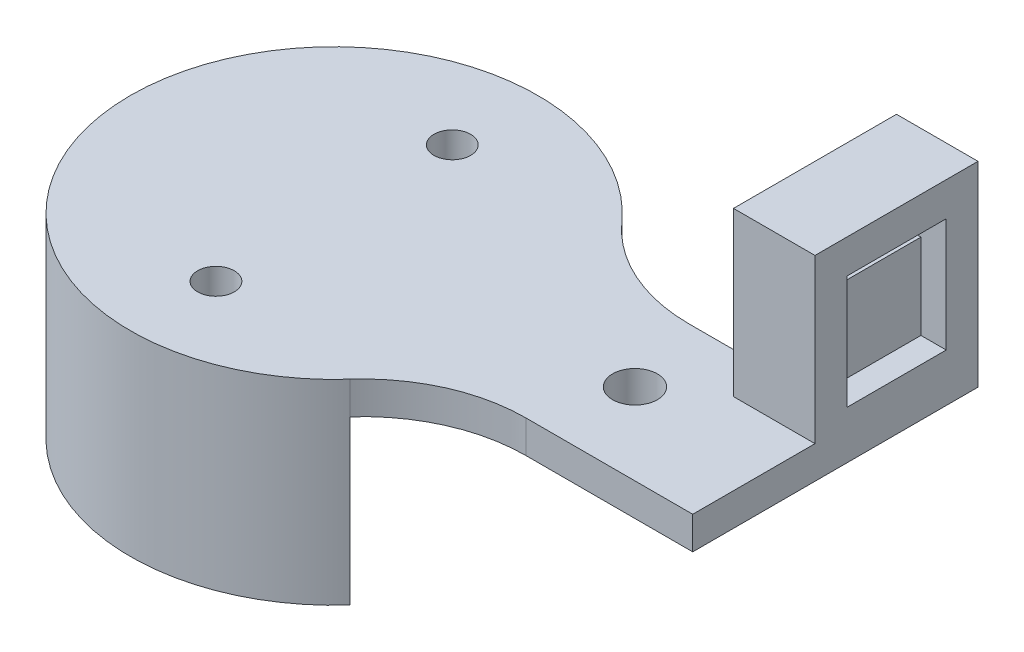
ISO-10303-21;
HEADER;
FILE_DESCRIPTION(('STEP AP214'),'2;1');
FILE_NAME('part.step','',(''),(''),'','','');
FILE_SCHEMA(('AUTOMOTIVE_DESIGN { 1 0 10303 214 1 1 1 1 }'));
ENDSEC;
DATA;
#1=APPLICATION_CONTEXT('core data for automotive mechanical design processes');
#2=APPLICATION_PROTOCOL_DEFINITION('international standard','automotive_design',2000,#1);
#3=PRODUCT_CONTEXT('',#1,'mechanical');
#4=PRODUCT('Part','Part','',(#3));
#5=PRODUCT_RELATED_PRODUCT_CATEGORY('part','',(#4));
#6=PRODUCT_DEFINITION_FORMATION('','',#4);
#7=PRODUCT_DEFINITION_CONTEXT('part definition',#1,'design');
#8=PRODUCT_DEFINITION('design','',#6,#7);
#9=PRODUCT_DEFINITION_SHAPE('','',#8);
#10=(LENGTH_UNIT() NAMED_UNIT(*) SI_UNIT(.MILLI.,.METRE.));
#11=(NAMED_UNIT(*) PLANE_ANGLE_UNIT() SI_UNIT($,.RADIAN.));
#12=(NAMED_UNIT(*) SI_UNIT($,.STERADIAN.) SOLID_ANGLE_UNIT());
#13=UNCERTAINTY_MEASURE_WITH_UNIT(LENGTH_MEASURE(1.E-05),#10,'distance_accuracy_value','');
#14=(GEOMETRIC_REPRESENTATION_CONTEXT(3) GLOBAL_UNCERTAINTY_ASSIGNED_CONTEXT((#13)) GLOBAL_UNIT_ASSIGNED_CONTEXT((#10,
#11,#12)) REPRESENTATION_CONTEXT('',''));
#15=CARTESIAN_POINT('',(0.,0.,0.));
#16=DIRECTION('',(0.,0.,1.));
#17=DIRECTION('',(1.,0.,0.));
#18=AXIS2_PLACEMENT_3D('',#15,#16,#17);
#19=CARTESIAN_POINT('',(54.,4.,-25.0000000000001));
#20=DIRECTION('',(-1.,0.,0.));
#21=DIRECTION('',(0.,0.,1.));
#22=AXIS2_PLACEMENT_3D('',#19,#20,#21);
#23=PLANE('',#22);
#24=DIRECTION('',(0.,0.,-1.));
#25=VECTOR('',#24,1.);
#26=CARTESIAN_POINT('',(54.,0.,-25.0000000000001));
#27=LINE('',#26,#25);
#28=CARTESIAN_POINT('',(54.,0.,9.99999999999999));
#29=VERTEX_POINT('',#28);
#30=CARTESIAN_POINT('',(54.,0.,-25.0000000000001));
#31=VERTEX_POINT('',#30);
#32=EDGE_CURVE('E348',#29,#31,#27,.T.);
#33=ORIENTED_EDGE('',*,*,#32,.T.);
#34=DIRECTION('',(0.,-1.,0.));
#35=VECTOR('',#34,1.);
#36=CARTESIAN_POINT('',(54.,4.,-25.0000000000001));
#37=LINE('',#36,#35);
#38=CARTESIAN_POINT('',(54.,24.,-25.0000000000001));
#39=VERTEX_POINT('',#38);
#40=EDGE_CURVE('E358',#39,#31,#37,.T.);
#41=ORIENTED_EDGE('',*,*,#40,.F.);
#42=DIRECTION('',(0.,0.,1.));
#43=VECTOR('',#42,1.);
#44=CARTESIAN_POINT('',(54.,24.,-25.0000000000001));
#45=LINE('',#44,#43);
#46=CARTESIAN_POINT('',(54.,24.,-5.00000000000011));
#47=VERTEX_POINT('',#46);
#48=EDGE_CURVE('E237',#39,#47,#45,.T.);
#49=ORIENTED_EDGE('',*,*,#48,.T.);
#50=DIRECTION('',(0.,-1.,0.));
#51=VECTOR('',#50,1.);
#52=CARTESIAN_POINT('',(54.,24.,-5.00000000000011));
#53=LINE('',#52,#51);
#54=CARTESIAN_POINT('',(54.,4.,-5.00000000000012));
#55=VERTEX_POINT('',#54);
#56=EDGE_CURVE('E247',#47,#55,#53,.T.);
#57=ORIENTED_EDGE('',*,*,#56,.T.);
#58=DIRECTION('',(0.,0.,-1.));
#59=VECTOR('',#58,1.);
#60=CARTESIAN_POINT('',(54.,4.,-25.0000000000001));
#61=LINE('',#60,#59);
#62=CARTESIAN_POINT('',(54.,4.,9.99999999999999));
#63=VERTEX_POINT('',#62);
#64=EDGE_CURVE('E355',#63,#55,#61,.T.);
#65=ORIENTED_EDGE('',*,*,#64,.F.);
#66=DIRECTION('',(0.,-1.,0.));
#67=VECTOR('',#66,1.);
#68=CARTESIAN_POINT('',(54.,4.,9.99999999999999));
#69=LINE('',#68,#67);
#70=EDGE_CURVE('E377',#63,#29,#69,.T.);
#71=ORIENTED_EDGE('',*,*,#70,.T.);
#72=EDGE_LOOP('',(#33,#41,#49,#57,#65,#71));
#73=FACE_BOUND('',#72,.T.);
#74=DIRECTION('',(0.,-1.,0.));
#75=VECTOR('',#74,1.);
#76=CARTESIAN_POINT('',(54.,18.1,-8.90000000000011));
#77=LINE('',#76,#75);
#78=CARTESIAN_POINT('',(54.,19.85,-8.90000000000011));
#79=VERTEX_POINT('',#78);
#80=CARTESIAN_POINT('',(54.,5.9,-8.90000000000011));
#81=VERTEX_POINT('',#80);
#82=EDGE_CURVE('E206',#79,#81,#77,.T.);
#83=ORIENTED_EDGE('',*,*,#82,.F.);
#84=DIRECTION('',(0.,0.,-1.));
#85=VECTOR('',#84,1.);
#86=CARTESIAN_POINT('',(54.,19.85,-8.90000000000011));
#87=LINE('',#86,#85);
#88=CARTESIAN_POINT('',(54.,19.85,-21.1000000000001));
#89=VERTEX_POINT('',#88);
#90=EDGE_CURVE('E500',#79,#89,#87,.T.);
#91=ORIENTED_EDGE('',*,*,#90,.T.);
#92=DIRECTION('',(0.,-1.,0.));
#93=VECTOR('',#92,1.);
#94=CARTESIAN_POINT('',(54.,18.1,-21.1000000000001));
#95=LINE('',#94,#93);
#96=CARTESIAN_POINT('',(54.,5.9,-21.1000000000001));
#97=VERTEX_POINT('',#96);
#98=EDGE_CURVE('E220',#89,#97,#95,.T.);
#99=ORIENTED_EDGE('',*,*,#98,.T.);
#100=DIRECTION('',(0.,0.,-1.));
#101=VECTOR('',#100,1.);
#102=CARTESIAN_POINT('',(54.,5.9,-8.90000000000011));
#103=LINE('',#102,#101);
#104=EDGE_CURVE('E213',#81,#97,#103,.T.);
#105=ORIENTED_EDGE('',*,*,#104,.F.);
#106=EDGE_LOOP('',(#83,#91,#99,#105));
#107=FACE_BOUND('',#106,.T.);
#108=ADVANCED_FACE('F41',(#73,#107),#23,.F.);
#109=CARTESIAN_POINT('',(44.,4.,-25.0000000000001));
#110=DIRECTION('',(0.,0.,1.));
#111=DIRECTION('',(1.,0.,0.));
#112=AXIS2_PLACEMENT_3D('',#109,#110,#111);
#113=PLANE('',#112);
#114=DIRECTION('',(-1.,0.,0.));
#115=VECTOR('',#114,1.);
#116=CARTESIAN_POINT('',(44.,0.,-25.0000000000001));
#117=LINE('',#116,#115);
#118=CARTESIAN_POINT('',(44.,0.,-25.0000000000001));
#119=VERTEX_POINT('',#118);
#120=EDGE_CURVE('E323',#31,#119,#117,.T.);
#121=ORIENTED_EDGE('',*,*,#120,.T.);
#122=DIRECTION('',(0.,-1.,0.));
#123=VECTOR('',#122,1.);
#124=CARTESIAN_POINT('',(44.,4.,-25.0000000000001));
#125=LINE('',#124,#123);
#126=CARTESIAN_POINT('',(44.,24.,-25.0000000000001));
#127=VERTEX_POINT('',#126);
#128=EDGE_CURVE('E385',#127,#119,#125,.T.);
#129=ORIENTED_EDGE('',*,*,#128,.F.);
#130=DIRECTION('',(1.,0.,0.));
#131=VECTOR('',#130,1.);
#132=CARTESIAN_POINT('',(44.,24.,-25.0000000000001));
#133=LINE('',#132,#131);
#134=EDGE_CURVE('E233',#127,#39,#133,.T.);
#135=ORIENTED_EDGE('',*,*,#134,.T.);
#136=ORIENTED_EDGE('',*,*,#40,.T.);
#137=EDGE_LOOP('',(#121,#129,#135,#136));
#138=FACE_BOUND('',#137,.T.);
#139=ADVANCED_FACE('F441',(#138),#113,.F.);
#140=CARTESIAN_POINT('',(44.,4.,-10.));
#141=DIRECTION('',(1.,0.,0.));
#142=DIRECTION('',(0.,0.,-1.));
#143=AXIS2_PLACEMENT_3D('',#140,#141,#142);
#144=PLANE('',#143);
#145=DIRECTION('',(0.,0.,1.));
#146=VECTOR('',#145,1.);
#147=CARTESIAN_POINT('',(44.,19.85,-8.90000000000027));
#148=LINE('',#147,#146);
#149=CARTESIAN_POINT('',(44.,19.85,-21.1000000000001));
#150=VERTEX_POINT('',#149);
#151=CARTESIAN_POINT('',(44.,19.85,-8.90000000000011));
#152=VERTEX_POINT('',#151);
#153=EDGE_CURVE('E491',#150,#152,#148,.T.);
#154=ORIENTED_EDGE('',*,*,#153,.T.);
#155=DIRECTION('',(0.,1.,0.));
#156=VECTOR('',#155,1.);
#157=CARTESIAN_POINT('',(44.,19.85,-8.90000000000011));
#158=LINE('',#157,#156);
#159=CARTESIAN_POINT('',(44.,16.35,-8.90000000000011));
#160=VERTEX_POINT('',#159);
#161=EDGE_CURVE('E493',#160,#152,#158,.T.);
#162=ORIENTED_EDGE('',*,*,#161,.F.);
#163=DIRECTION('',(0.,0.,1.));
#164=VECTOR('',#163,1.);
#165=CARTESIAN_POINT('',(44.,16.35,-8.90000000000027));
#166=LINE('',#165,#164);
#167=CARTESIAN_POINT('',(44.,16.35,-21.1000000000001));
#168=VERTEX_POINT('',#167);
#169=EDGE_CURVE('E192',#168,#160,#166,.T.);
#170=ORIENTED_EDGE('',*,*,#169,.F.);
#171=DIRECTION('',(0.,1.,0.));
#172=VECTOR('',#171,1.);
#173=CARTESIAN_POINT('',(44.,19.85,-21.1000000000001));
#174=LINE('',#173,#172);
#175=EDGE_CURVE('E58',#168,#150,#174,.T.);
#176=ORIENTED_EDGE('',*,*,#175,.T.);
#177=EDGE_LOOP('',(#154,#162,#170,#176));
#178=FACE_BOUND('',#177,.T.);
#179=DIRECTION('',(0.,0.,1.));
#180=VECTOR('',#179,1.);
#181=CARTESIAN_POINT('',(44.,0.,-10.));
#182=LINE('',#181,#180);
#183=CARTESIAN_POINT('',(44.,0.,-10.));
#184=VERTEX_POINT('',#183);
#185=EDGE_CURVE('E362',#119,#184,#182,.T.);
#186=ORIENTED_EDGE('',*,*,#185,.T.);
#187=DIRECTION('',(0.,-1.,0.));
#188=VECTOR('',#187,1.);
#189=CARTESIAN_POINT('',(44.,4.,-10.));
#190=LINE('',#189,#188);
#191=CARTESIAN_POINT('',(44.,4.,-10.));
#192=VERTEX_POINT('',#191);
#193=EDGE_CURVE('E381',#192,#184,#190,.T.);
#194=ORIENTED_EDGE('',*,*,#193,.F.);
#195=DIRECTION('',(0.,0.,1.));
#196=VECTOR('',#195,1.);
#197=CARTESIAN_POINT('',(44.,4.,-25.0000000000001));
#198=LINE('',#197,#196);
#199=CARTESIAN_POINT('',(44.,4.,-5.00000000000011));
#200=VERTEX_POINT('',#199);
#201=EDGE_CURVE('E11',#192,#200,#198,.T.);
#202=ORIENTED_EDGE('',*,*,#201,.T.);
#203=DIRECTION('',(0.,-1.,0.));
#204=VECTOR('',#203,1.);
#205=CARTESIAN_POINT('',(44.,24.,-5.00000000000011));
#206=LINE('',#205,#204);
#207=CARTESIAN_POINT('',(44.,24.,-5.00000000000011));
#208=VERTEX_POINT('',#207);
#209=EDGE_CURVE('E251',#208,#200,#206,.T.);
#210=ORIENTED_EDGE('',*,*,#209,.F.);
#211=DIRECTION('',(0.,0.,1.));
#212=VECTOR('',#211,1.);
#213=CARTESIAN_POINT('',(44.,24.,-25.0000000000001));
#214=LINE('',#213,#212);
#215=EDGE_CURVE('E244',#127,#208,#214,.T.);
#216=ORIENTED_EDGE('',*,*,#215,.F.);
#217=ORIENTED_EDGE('',*,*,#128,.T.);
#218=EDGE_LOOP('',(#186,#194,#202,#210,#216,#217));
#219=FACE_BOUND('',#218,.T.);
#220=ADVANCED_FACE('F437',(#178,#219),#144,.F.);
#221=CARTESIAN_POINT('',(22.9128784747792,4.,-10.0000000000001));
#222=DIRECTION('',(0.,0.,1.));
#223=DIRECTION('',(1.,0.,0.));
#224=AXIS2_PLACEMENT_3D('',#221,#222,#223);
#225=PLANE('',#224);
#226=DIRECTION('',(-1.,0.,0.));
#227=VECTOR('',#226,1.);
#228=CARTESIAN_POINT('',(22.9128784747792,0.,-10.0000000000001));
#229=LINE('',#228,#227);
#230=CARTESIAN_POINT('',(33.5410196624967,0.,-10.0000000000001));
#231=VERTEX_POINT('',#230);
#232=EDGE_CURVE('E365',#184,#231,#229,.T.);
#233=ORIENTED_EDGE('',*,*,#232,.T.);
#234=DIRECTION('',(0.,1.,0.));
#235=VECTOR('',#234,1.);
#236=CARTESIAN_POINT('',(33.5410196624967,4.,-10.0000000000001));
#237=LINE('',#236,#235);
#238=CARTESIAN_POINT('',(33.5410196624967,4.,-10.0000000000001));
#239=VERTEX_POINT('',#238);
#240=EDGE_CURVE('E400',#231,#239,#237,.T.);
#241=ORIENTED_EDGE('',*,*,#240,.T.);
#242=DIRECTION('',(-1.,0.,0.));
#243=VECTOR('',#242,1.);
#244=CARTESIAN_POINT('',(22.9128784747792,4.,-10.0000000000001));
#245=LINE('',#244,#243);
#246=EDGE_CURVE('E343',#192,#239,#245,.T.);
#247=ORIENTED_EDGE('',*,*,#246,.F.);
#248=ORIENTED_EDGE('',*,*,#193,.T.);
#249=EDGE_LOOP('',(#233,#241,#247,#248));
#250=FACE_BOUND('',#249,.T.);
#251=ADVANCED_FACE('F430',(#250),#225,.F.);
#252=CARTESIAN_POINT('',(0.,4.,0.));
#253=DIRECTION('',(0.,-1.,0.));
#254=DIRECTION('',(0.,0.,-1.));
#255=AXIS2_PLACEMENT_3D('',#252,#253,#254);
#256=CYLINDRICAL_SURFACE('',#255,25.);
#257=DIRECTION('',(0.,-1.,0.));
#258=VECTOR('',#257,1.);
#259=CARTESIAN_POINT('',(18.6338998124982,4.,-16.6666666666667));
#260=LINE('',#259,#258);
#261=CARTESIAN_POINT('',(18.6338998124982,4.,-16.6666666666667));
#262=VERTEX_POINT('',#261);
#263=CARTESIAN_POINT('',(18.6338998124982,0.,-16.6666666666667));
#264=VERTEX_POINT('',#263);
#265=EDGE_CURVE('E393',#262,#264,#260,.T.);
#266=ORIENTED_EDGE('',*,*,#265,.T.);
#267=DIRECTION('',(0.,1.,0.));
#268=VECTOR('',#267,1.);
#269=CARTESIAN_POINT('',(18.6338998124982,-20.,-16.6666666666667));
#270=LINE('',#269,#268);
#271=CARTESIAN_POINT('',(18.6338998124982,-20.,-16.6666666666667));
#272=VERTEX_POINT('',#271);
#273=EDGE_CURVE('E308',#272,#264,#270,.T.);
#274=ORIENTED_EDGE('',*,*,#273,.F.);
#275=CARTESIAN_POINT('',(0.,-20.,0.));
#276=DIRECTION('',(0.,-1.,0.));
#277=DIRECTION('',(0.,0.,-1.));
#278=AXIS2_PLACEMENT_3D('',#275,#276,#277);
#279=CIRCLE('',#278,25.);
#280=CARTESIAN_POINT('',(18.6338998124983,-20.,16.6666666666666));
#281=VERTEX_POINT('',#280);
#282=EDGE_CURVE('E267',#281,#272,#279,.T.);
#283=ORIENTED_EDGE('',*,*,#282,.F.);
#284=DIRECTION('',(0.,1.,0.));
#285=VECTOR('',#284,1.);
#286=CARTESIAN_POINT('',(18.6338998124983,-20.,16.6666666666666));
#287=LINE('',#286,#285);
#288=CARTESIAN_POINT('',(18.6338998124983,0.,16.6666666666666));
#289=VERTEX_POINT('',#288);
#290=EDGE_CURVE('E311',#281,#289,#287,.T.);
#291=ORIENTED_EDGE('',*,*,#290,.T.);
#292=DIRECTION('',(0.,-1.,0.));
#293=VECTOR('',#292,1.);
#294=CARTESIAN_POINT('',(18.6338998124983,4.,16.6666666666666));
#295=LINE('',#294,#293);
#296=CARTESIAN_POINT('',(18.6338998124983,4.,16.6666666666666));
#297=VERTEX_POINT('',#296);
#298=EDGE_CURVE('E397',#289,#297,#295,.F.);
#299=ORIENTED_EDGE('',*,*,#298,.T.);
#300=CARTESIAN_POINT('',(0.,4.,0.));
#301=DIRECTION('',(0.,1.,0.));
#302=DIRECTION('',(0.,0.,1.));
#303=AXIS2_PLACEMENT_3D('',#300,#301,#302);
#304=CIRCLE('',#303,25.);
#305=EDGE_CURVE('E347',#262,#297,#304,.T.);
#306=ORIENTED_EDGE('',*,*,#305,.F.);
#307=EDGE_LOOP('',(#266,#274,#283,#291,#299,#306));
#308=FACE_BOUND('',#307,.T.);
#309=ADVANCED_FACE('F426',(#308),#256,.T.);
#310=CARTESIAN_POINT('',(54.,4.,9.99999999999999));
#311=DIRECTION('',(0.,0.,-1.));
#312=DIRECTION('',(-1.,0.,0.));
#313=AXIS2_PLACEMENT_3D('',#310,#311,#312);
#314=PLANE('',#313);
#315=DIRECTION('',(1.,0.,0.));
#316=VECTOR('',#315,1.);
#317=CARTESIAN_POINT('',(54.,4.,9.99999999999999));
#318=LINE('',#317,#316);
#319=CARTESIAN_POINT('',(33.541019662497,4.,9.99999999999992));
#320=VERTEX_POINT('',#319);
#321=EDGE_CURVE('E352',#320,#63,#318,.T.);
#322=ORIENTED_EDGE('',*,*,#321,.F.);
#323=DIRECTION('',(0.,1.,0.));
#324=VECTOR('',#323,1.);
#325=CARTESIAN_POINT('',(33.541019662497,0.,9.99999999999993));
#326=LINE('',#325,#324);
#327=CARTESIAN_POINT('',(33.541019662497,0.,9.99999999999992));
#328=VERTEX_POINT('',#327);
#329=EDGE_CURVE('E389',#320,#328,#326,.F.);
#330=ORIENTED_EDGE('',*,*,#329,.T.);
#331=DIRECTION('',(1.,0.,0.));
#332=VECTOR('',#331,1.);
#333=CARTESIAN_POINT('',(54.,0.,9.99999999999999));
#334=LINE('',#333,#332);
#335=EDGE_CURVE('E369',#328,#29,#334,.T.);
#336=ORIENTED_EDGE('',*,*,#335,.T.);
#337=ORIENTED_EDGE('',*,*,#70,.F.);
#338=EDGE_LOOP('',(#322,#330,#336,#337));
#339=FACE_BOUND('',#338,.T.);
#340=ADVANCED_FACE('F456',(#339),#314,.F.);
#341=CARTESIAN_POINT('',(0.,4.,0.));
#342=DIRECTION('',(0.,1.,0.));
#343=DIRECTION('',(0.,0.,1.));
#344=AXIS2_PLACEMENT_3D('',#341,#342,#343);
#345=PLANE('',#344);
#346=DIRECTION('',(1.,0.,0.));
#347=VECTOR('',#346,1.);
#348=CARTESIAN_POINT('',(44.,4.,-5.00000000000011));
#349=LINE('',#348,#347);
#350=EDGE_CURVE('E232',#200,#55,#349,.T.);
#351=ORIENTED_EDGE('',*,*,#350,.F.);
#352=ORIENTED_EDGE('',*,*,#201,.F.);
#353=ORIENTED_EDGE('',*,*,#246,.T.);
#354=CARTESIAN_POINT('',(33.5410196624968,4.,-30.0000000000001));
#355=DIRECTION('',(0.,1.,0.));
#356=DIRECTION('',(0.,0.,1.));
#357=AXIS2_PLACEMENT_3D('',#354,#355,#356);
#358=CIRCLE('',#357,20.);
#359=EDGE_CURVE('E45',#239,#262,#358,.F.);
#360=ORIENTED_EDGE('',*,*,#359,.T.);
#361=ORIENTED_EDGE('',*,*,#305,.T.);
#362=CARTESIAN_POINT('',(33.5410196624969,4.,29.9999999999999));
#363=DIRECTION('',(0.,1.,0.));
#364=DIRECTION('',(0.,0.,1.));
#365=AXIS2_PLACEMENT_3D('',#362,#363,#364);
#366=CIRCLE('',#365,20.);
#367=EDGE_CURVE('E407',#297,#320,#366,.F.);
#368=ORIENTED_EDGE('',*,*,#367,.T.);
#369=ORIENTED_EDGE('',*,*,#321,.T.);
#370=ORIENTED_EDGE('',*,*,#64,.T.);
#371=EDGE_LOOP('',(#351,#352,#353,#360,#361,#368,#369,#370));
#372=FACE_BOUND('',#371,.T.);
#373=CARTESIAN_POINT('',(0.,4.,-14.5));
#374=DIRECTION('',(0.,1.,0.));
#375=DIRECTION('',(0.,0.,1.));
#376=AXIS2_PLACEMENT_3D('',#373,#374,#375);
#377=CIRCLE('',#376,2.25);
#378=CARTESIAN_POINT('',(0.,4.,-12.25));
#379=VERTEX_POINT('',#378);
#380=EDGE_CURVE('E319',#379,#379,#377,.T.);
#381=ORIENTED_EDGE('',*,*,#380,.F.);
#382=EDGE_LOOP('',(#381));
#383=FACE_BOUND('',#382,.T.);
#384=CARTESIAN_POINT('',(0.,4.,14.5));
#385=DIRECTION('',(0.,1.,0.));
#386=DIRECTION('',(0.,0.,1.));
#387=AXIS2_PLACEMENT_3D('',#384,#385,#386);
#388=CIRCLE('',#387,2.25);
#389=CARTESIAN_POINT('',(0.,4.,16.75));
#390=VERTEX_POINT('',#389);
#391=EDGE_CURVE('E328',#390,#390,#388,.T.);
#392=ORIENTED_EDGE('',*,*,#391,.F.);
#393=EDGE_LOOP('',(#392));
#394=FACE_BOUND('',#393,.T.);
#395=CARTESIAN_POINT('',(36.9128784747792,4.,0.));
#396=DIRECTION('',(0.,1.,0.));
#397=DIRECTION('',(0.,0.,1.));
#398=AXIS2_PLACEMENT_3D('',#395,#396,#397);
#399=CIRCLE('',#398,2.75000000000001);
#400=CARTESIAN_POINT('',(36.9128784747792,4.,2.75000000000001));
#401=VERTEX_POINT('',#400);
#402=EDGE_CURVE('E336',#401,#401,#399,.T.);
#403=ORIENTED_EDGE('',*,*,#402,.F.);
#404=EDGE_LOOP('',(#403));
#405=FACE_BOUND('',#404,.T.);
#406=ADVANCED_FACE('F418',(#372,#383,#394,#405),#345,.T.);
#407=CARTESIAN_POINT('',(0.,0.,0.));
#408=DIRECTION('',(0.,1.,0.));
#409=DIRECTION('',(0.,0.,1.));
#410=AXIS2_PLACEMENT_3D('',#407,#408,#409);
#411=PLANE('',#410);
#412=CARTESIAN_POINT('',(0.,0.,-14.5));
#413=DIRECTION('',(0.,1.,0.));
#414=DIRECTION('',(0.,0.,1.));
#415=AXIS2_PLACEMENT_3D('',#412,#413,#414);
#416=CIRCLE('',#415,2.25);
#417=CARTESIAN_POINT('',(0.,0.,-12.25));
#418=VERTEX_POINT('',#417);
#419=EDGE_CURVE('E324',#418,#418,#416,.T.);
#420=ORIENTED_EDGE('',*,*,#419,.T.);
#421=EDGE_LOOP('',(#420));
#422=FACE_BOUND('',#421,.T.);
#423=CARTESIAN_POINT('',(0.,0.,14.5));
#424=DIRECTION('',(0.,1.,0.));
#425=DIRECTION('',(0.,0.,1.));
#426=AXIS2_PLACEMENT_3D('',#423,#424,#425);
#427=CIRCLE('',#426,2.25);
#428=CARTESIAN_POINT('',(0.,0.,16.75));
#429=VERTEX_POINT('',#428);
#430=EDGE_CURVE('E332',#429,#429,#427,.T.);
#431=ORIENTED_EDGE('',*,*,#430,.T.);
#432=EDGE_LOOP('',(#431));
#433=FACE_BOUND('',#432,.T.);
#434=CARTESIAN_POINT('',(36.9128784747792,0.,0.));
#435=DIRECTION('',(0.,1.,0.));
#436=DIRECTION('',(0.,0.,1.));
#437=AXIS2_PLACEMENT_3D('',#434,#435,#436);
#438=CIRCLE('',#437,2.75000000000001);
#439=CARTESIAN_POINT('',(36.9128784747792,0.,2.75000000000001));
#440=VERTEX_POINT('',#439);
#441=EDGE_CURVE('E318',#440,#440,#438,.T.);
#442=ORIENTED_EDGE('',*,*,#441,.T.);
#443=EDGE_LOOP('',(#442));
#444=FACE_BOUND('',#443,.T.);
#445=CARTESIAN_POINT('',(16.1189826543324,0.,-17.1005379502907));
#446=DIRECTION('',(0.,1.,0.));
#447=DIRECTION('',(0.,0.,1.));
#448=AXIS2_PLACEMENT_3D('',#445,#446,#447);
#449=CIRCLE('',#448,2.);
#450=CARTESIAN_POINT('',(14.7471543433254,0.,-15.6451730183511));
#451=VERTEX_POINT('',#450);
#452=CARTESIAN_POINT('',(17.4523159876657,0.,-15.6098259652909));
#453=VERTEX_POINT('',#452);
#454=EDGE_CURVE('E293',#451,#453,#449,.T.);
#455=ORIENTED_EDGE('',*,*,#454,.T.);
#456=DIRECTION('',(0.745355992499929,0.,-0.666666666666668));
#457=VECTOR('',#456,1.);
#458=CARTESIAN_POINT('',(17.4523159876657,0.,-15.6098259652909));
#459=LINE('',#458,#457);
#460=EDGE_CURVE('E289',#453,#264,#459,.T.);
#461=ORIENTED_EDGE('',*,*,#460,.T.);
#462=CARTESIAN_POINT('',(33.5410196624968,0.,-30.0000000000001));
#463=DIRECTION('',(0.,1.,0.));
#464=DIRECTION('',(0.,0.,1.));
#465=AXIS2_PLACEMENT_3D('',#462,#463,#464);
#466=CIRCLE('',#465,20.);
#467=EDGE_CURVE('E409',#264,#231,#466,.T.);
#468=ORIENTED_EDGE('',*,*,#467,.T.);
#469=ORIENTED_EDGE('',*,*,#232,.F.);
#470=ORIENTED_EDGE('',*,*,#185,.F.);
#471=ORIENTED_EDGE('',*,*,#120,.F.);
#472=ORIENTED_EDGE('',*,*,#32,.F.);
#473=ORIENTED_EDGE('',*,*,#335,.F.);
#474=CARTESIAN_POINT('',(33.5410196624969,0.,29.9999999999999));
#475=DIRECTION('',(0.,1.,0.));
#476=DIRECTION('',(0.,0.,1.));
#477=AXIS2_PLACEMENT_3D('',#474,#475,#476);
#478=CIRCLE('',#477,20.);
#479=EDGE_CURVE('E403',#328,#289,#478,.T.);
#480=ORIENTED_EDGE('',*,*,#479,.T.);
#481=DIRECTION('',(-0.745355992499933,0.,-0.666666666666664));
#482=VECTOR('',#481,1.);
#483=CARTESIAN_POINT('',(18.6338998124983,0.,16.6666666666666));
#484=LINE('',#483,#482);
#485=CARTESIAN_POINT('',(17.4523159876658,0.,15.6098259652907));
#486=VERTEX_POINT('',#485);
#487=EDGE_CURVE('E285',#289,#486,#484,.T.);
#488=ORIENTED_EDGE('',*,*,#487,.T.);
#489=CARTESIAN_POINT('',(16.1189826543325,0.,17.1005379502906));
#490=DIRECTION('',(0.,-1.,0.));
#491=DIRECTION('',(0.,0.,-1.));
#492=AXIS2_PLACEMENT_3D('',#489,#490,#491);
#493=CIRCLE('',#492,2.);
#494=CARTESIAN_POINT('',(14.7471543433255,0.,15.645173018351));
#495=VERTEX_POINT('',#494);
#496=EDGE_CURVE('E255',#495,#486,#493,.T.);
#497=ORIENTED_EDGE('',*,*,#496,.F.);
#498=CARTESIAN_POINT('',(0.,0.,0.));
#499=DIRECTION('',(0.,-1.,0.));
#500=DIRECTION('',(0.,0.,-1.));
#501=AXIS2_PLACEMENT_3D('',#498,#499,#500);
#502=CIRCLE('',#501,21.5);
#503=EDGE_CURVE('E263',#495,#451,#502,.T.);
#504=ORIENTED_EDGE('',*,*,#503,.T.);
#505=EDGE_LOOP('',(#455,#461,#468,#469,#470,#471,#472,#473,#480,#488,#497,#504));
#506=FACE_BOUND('',#505,.T.);
#507=ADVANCED_FACE('F432',(#422,#433,#444,#506),#411,.F.);
#508=CARTESIAN_POINT('',(33.5410196624969,4.,29.9999999999999));
#509=DIRECTION('',(0.,-1.,0.));
#510=DIRECTION('',(0.,0.,-1.));
#511=AXIS2_PLACEMENT_3D('',#508,#509,#510);
#512=CYLINDRICAL_SURFACE('',#511,20.);
#513=ORIENTED_EDGE('',*,*,#367,.F.);
#514=ORIENTED_EDGE('',*,*,#298,.F.);
#515=ORIENTED_EDGE('',*,*,#479,.F.);
#516=ORIENTED_EDGE('',*,*,#329,.F.);
#517=EDGE_LOOP('',(#513,#514,#515,#516));
#518=FACE_BOUND('',#517,.T.);
#519=ADVANCED_FACE('F461',(#518),#512,.F.);
#520=CARTESIAN_POINT('',(33.5410196624968,4.,-30.0000000000001));
#521=DIRECTION('',(0.,-1.,0.));
#522=DIRECTION('',(0.,0.,-1.));
#523=AXIS2_PLACEMENT_3D('',#520,#521,#522);
#524=CYLINDRICAL_SURFACE('',#523,20.);
#525=ORIENTED_EDGE('',*,*,#359,.F.);
#526=ORIENTED_EDGE('',*,*,#240,.F.);
#527=ORIENTED_EDGE('',*,*,#467,.F.);
#528=ORIENTED_EDGE('',*,*,#265,.F.);
#529=EDGE_LOOP('',(#525,#526,#527,#528));
#530=FACE_BOUND('',#529,.T.);
#531=ADVANCED_FACE('F43',(#530),#524,.F.);
#532=CARTESIAN_POINT('',(36.9128784747792,4.,0.));
#533=DIRECTION('',(0.,-1.,0.));
#534=DIRECTION('',(0.,0.,-1.));
#535=AXIS2_PLACEMENT_3D('',#532,#533,#534);
#536=CYLINDRICAL_SURFACE('',#535,2.75000000000001);
#537=ORIENTED_EDGE('',*,*,#402,.T.);
#538=EDGE_LOOP('',(#537));
#539=FACE_BOUND('',#538,.T.);
#540=ORIENTED_EDGE('',*,*,#441,.F.);
#541=EDGE_LOOP('',(#540));
#542=FACE_BOUND('',#541,.T.);
#543=ADVANCED_FACE('F467',(#539,#542),#536,.F.);
#544=CARTESIAN_POINT('',(0.,4.,14.5));
#545=DIRECTION('',(0.,-1.,0.));
#546=DIRECTION('',(0.,0.,-1.));
#547=AXIS2_PLACEMENT_3D('',#544,#545,#546);
#548=CYLINDRICAL_SURFACE('',#547,2.25);
#549=ORIENTED_EDGE('',*,*,#391,.T.);
#550=EDGE_LOOP('',(#549));
#551=FACE_BOUND('',#550,.T.);
#552=ORIENTED_EDGE('',*,*,#430,.F.);
#553=EDGE_LOOP('',(#552));
#554=FACE_BOUND('',#553,.T.);
#555=ADVANCED_FACE('F563',(#551,#554),#548,.F.);
#556=CARTESIAN_POINT('',(0.,4.,-14.5));
#557=DIRECTION('',(0.,-1.,0.));
#558=DIRECTION('',(0.,0.,-1.));
#559=AXIS2_PLACEMENT_3D('',#556,#557,#558);
#560=CYLINDRICAL_SURFACE('',#559,2.25);
#561=ORIENTED_EDGE('',*,*,#380,.T.);
#562=EDGE_LOOP('',(#561));
#563=FACE_BOUND('',#562,.T.);
#564=ORIENTED_EDGE('',*,*,#419,.F.);
#565=EDGE_LOOP('',(#564));
#566=FACE_BOUND('',#565,.T.);
#567=ADVANCED_FACE('F559',(#563,#566),#560,.F.);
#568=CARTESIAN_POINT('',(16.1189826543325,-20.,17.1005379502906));
#569=DIRECTION('',(0.,1.,0.));
#570=DIRECTION('',(0.,0.,1.));
#571=AXIS2_PLACEMENT_3D('',#568,#569,#570);
#572=CYLINDRICAL_SURFACE('',#571,2.);
#573=ORIENTED_EDGE('',*,*,#496,.T.);
#574=DIRECTION('',(0.,1.,0.));
#575=VECTOR('',#574,1.);
#576=CARTESIAN_POINT('',(17.4523159876658,-20.,15.6098259652907));
#577=LINE('',#576,#575);
#578=CARTESIAN_POINT('',(17.4523159876658,-20.,15.6098259652907));
#579=VERTEX_POINT('',#578);
#580=EDGE_CURVE('E314',#579,#486,#577,.T.);
#581=ORIENTED_EDGE('',*,*,#580,.F.);
#582=CARTESIAN_POINT('',(16.1189826543325,-20.,17.1005379502906));
#583=DIRECTION('',(0.,-1.,0.));
#584=DIRECTION('',(0.,0.,-1.));
#585=AXIS2_PLACEMENT_3D('',#582,#583,#584);
#586=CIRCLE('',#585,2.);
#587=CARTESIAN_POINT('',(14.7471543433255,-20.,15.645173018351));
#588=VERTEX_POINT('',#587);
#589=EDGE_CURVE('E259',#588,#579,#586,.T.);
#590=ORIENTED_EDGE('',*,*,#589,.F.);
#591=DIRECTION('',(0.,1.,0.));
#592=VECTOR('',#591,1.);
#593=CARTESIAN_POINT('',(14.7471543433255,-20.,15.645173018351));
#594=LINE('',#593,#592);
#595=EDGE_CURVE('E282',#588,#495,#594,.T.);
#596=ORIENTED_EDGE('',*,*,#595,.T.);
#597=EDGE_LOOP('',(#573,#581,#590,#596));
#598=FACE_BOUND('',#597,.T.);
#599=ADVANCED_FACE('F555',(#598),#572,.T.);
#600=CARTESIAN_POINT('',(18.6338998124983,-20.,16.6666666666666));
#601=DIRECTION('',(0.666666666666664,0.,-0.745355992499933));
#602=DIRECTION('',(-0.745355992499933,0.,-0.666666666666664));
#603=AXIS2_PLACEMENT_3D('',#600,#601,#602);
#604=PLANE('',#603);
#605=ORIENTED_EDGE('',*,*,#487,.F.);
#606=ORIENTED_EDGE('',*,*,#290,.F.);
#607=DIRECTION('',(-0.745355992499933,0.,-0.666666666666664));
#608=VECTOR('',#607,1.);
#609=CARTESIAN_POINT('',(18.6338998124983,-20.,16.6666666666666));
#610=LINE('',#609,#608);
#611=EDGE_CURVE('E262',#281,#579,#610,.T.);
#612=ORIENTED_EDGE('',*,*,#611,.T.);
#613=ORIENTED_EDGE('',*,*,#580,.T.);
#614=EDGE_LOOP('',(#605,#606,#612,#613));
#615=FACE_BOUND('',#614,.T.);
#616=ADVANCED_FACE('F551',(#615),#604,.T.);
#617=CARTESIAN_POINT('',(17.4523159876657,-20.,-15.6098259652909));
#618=DIRECTION('',(0.666666666666668,0.,0.745355992499929));
#619=DIRECTION('',(0.745355992499929,0.,-0.666666666666668));
#620=AXIS2_PLACEMENT_3D('',#617,#618,#619);
#621=PLANE('',#620);
#622=ORIENTED_EDGE('',*,*,#460,.F.);
#623=DIRECTION('',(0.,1.,0.));
#624=VECTOR('',#623,1.);
#625=CARTESIAN_POINT('',(17.4523159876657,-20.,-15.6098259652909));
#626=LINE('',#625,#624);
#627=CARTESIAN_POINT('',(17.4523159876657,-20.,-15.6098259652909));
#628=VERTEX_POINT('',#627);
#629=EDGE_CURVE('E305',#628,#453,#626,.T.);
#630=ORIENTED_EDGE('',*,*,#629,.F.);
#631=DIRECTION('',(0.745355992499929,0.,-0.666666666666668));
#632=VECTOR('',#631,1.);
#633=CARTESIAN_POINT('',(17.4523159876657,-20.,-15.6098259652909));
#634=LINE('',#633,#632);
#635=EDGE_CURVE('E270',#628,#272,#634,.T.);
#636=ORIENTED_EDGE('',*,*,#635,.T.);
#637=ORIENTED_EDGE('',*,*,#273,.T.);
#638=EDGE_LOOP('',(#622,#630,#636,#637));
#639=FACE_BOUND('',#638,.T.);
#640=ADVANCED_FACE('F547',(#639),#621,.T.);
#641=CARTESIAN_POINT('',(16.1189826543324,-20.,-17.1005379502907));
#642=DIRECTION('',(0.,1.,0.));
#643=DIRECTION('',(0.,0.,1.));
#644=AXIS2_PLACEMENT_3D('',#641,#642,#643);
#645=CYLINDRICAL_SURFACE('',#644,2.);
#646=ORIENTED_EDGE('',*,*,#454,.F.);
#647=DIRECTION('',(0.,1.,0.));
#648=VECTOR('',#647,1.);
#649=CARTESIAN_POINT('',(14.7471543433254,-20.,-15.6451730183511));
#650=LINE('',#649,#648);
#651=CARTESIAN_POINT('',(14.7471543433254,-20.,-15.6451730183511));
#652=VERTEX_POINT('',#651);
#653=EDGE_CURVE('E302',#652,#451,#650,.T.);
#654=ORIENTED_EDGE('',*,*,#653,.F.);
#655=CARTESIAN_POINT('',(16.1189826543324,-20.,-17.1005379502907));
#656=DIRECTION('',(0.,1.,0.));
#657=DIRECTION('',(0.,0.,1.));
#658=AXIS2_PLACEMENT_3D('',#655,#656,#657);
#659=CIRCLE('',#658,2.);
#660=EDGE_CURVE('E274',#652,#628,#659,.T.);
#661=ORIENTED_EDGE('',*,*,#660,.T.);
#662=ORIENTED_EDGE('',*,*,#629,.T.);
#663=EDGE_LOOP('',(#646,#654,#661,#662));
#664=FACE_BOUND('',#663,.T.);
#665=ADVANCED_FACE('F543',(#664),#645,.T.);
#666=CARTESIAN_POINT('',(0.,-20.,0.));
#667=DIRECTION('',(0.,1.,0.));
#668=DIRECTION('',(0.,0.,1.));
#669=AXIS2_PLACEMENT_3D('',#666,#667,#668);
#670=CYLINDRICAL_SURFACE('',#669,21.5);
#671=ORIENTED_EDGE('',*,*,#503,.F.);
#672=ORIENTED_EDGE('',*,*,#595,.F.);
#673=CARTESIAN_POINT('',(0.,-20.,0.));
#674=DIRECTION('',(0.,-1.,0.));
#675=DIRECTION('',(0.,0.,-1.));
#676=AXIS2_PLACEMENT_3D('',#673,#674,#675);
#677=CIRCLE('',#676,21.5);
#678=EDGE_CURVE('E278',#588,#652,#677,.T.);
#679=ORIENTED_EDGE('',*,*,#678,.T.);
#680=ORIENTED_EDGE('',*,*,#653,.T.);
#681=EDGE_LOOP('',(#671,#672,#679,#680));
#682=FACE_BOUND('',#681,.T.);
#683=ADVANCED_FACE('F539',(#682),#670,.F.);
#684=CARTESIAN_POINT('',(16.1189826543325,-20.,17.1005379502906));
#685=DIRECTION('',(0.,-1.,0.));
#686=DIRECTION('',(0.,0.,-1.));
#687=AXIS2_PLACEMENT_3D('',#684,#685,#686);
#688=PLANE('',#687);
#689=ORIENTED_EDGE('',*,*,#589,.T.);
#690=ORIENTED_EDGE('',*,*,#611,.F.);
#691=ORIENTED_EDGE('',*,*,#282,.T.);
#692=ORIENTED_EDGE('',*,*,#635,.F.);
#693=ORIENTED_EDGE('',*,*,#660,.F.);
#694=ORIENTED_EDGE('',*,*,#678,.F.);
#695=EDGE_LOOP('',(#689,#690,#691,#692,#693,#694));
#696=FACE_BOUND('',#695,.T.);
#697=ADVANCED_FACE('F536',(#696),#688,.T.);
#698=CARTESIAN_POINT('',(44.,24.,-5.00000000000011));
#699=DIRECTION('',(0.,0.,-1.));
#700=DIRECTION('',(-1.,0.,0.));
#701=AXIS2_PLACEMENT_3D('',#698,#699,#700);
#702=PLANE('',#701);
#703=ORIENTED_EDGE('',*,*,#350,.T.);
#704=ORIENTED_EDGE('',*,*,#56,.F.);
#705=DIRECTION('',(1.,0.,0.));
#706=VECTOR('',#705,1.);
#707=CARTESIAN_POINT('',(44.,24.,-5.00000000000011));
#708=LINE('',#707,#706);
#709=EDGE_CURVE('E241',#208,#47,#708,.T.);
#710=ORIENTED_EDGE('',*,*,#709,.F.);
#711=ORIENTED_EDGE('',*,*,#209,.T.);
#712=EDGE_LOOP('',(#703,#704,#710,#711));
#713=FACE_BOUND('',#712,.T.);
#714=ADVANCED_FACE('F450',(#713),#702,.F.);
#715=CARTESIAN_POINT('',(0.,24.,0.));
#716=DIRECTION('',(0.,-1.,0.));
#717=DIRECTION('',(0.,0.,-1.));
#718=AXIS2_PLACEMENT_3D('',#715,#716,#717);
#719=PLANE('',#718);
#720=ORIENTED_EDGE('',*,*,#134,.F.);
#721=ORIENTED_EDGE('',*,*,#215,.T.);
#722=ORIENTED_EDGE('',*,*,#709,.T.);
#723=ORIENTED_EDGE('',*,*,#48,.F.);
#724=EDGE_LOOP('',(#720,#721,#722,#723));
#725=FACE_BOUND('',#724,.T.);
#726=ADVANCED_FACE('F446',(#725),#719,.F.);
#727=CARTESIAN_POINT('',(50.9,18.1,-21.1000000000001));
#728=DIRECTION('',(0.,0.,1.));
#729=DIRECTION('',(1.,0.,0.));
#730=AXIS2_PLACEMENT_3D('',#727,#728,#729);
#731=PLANE('',#730);
#732=ORIENTED_EDGE('',*,*,#98,.F.);
#733=DIRECTION('',(1.,0.,0.));
#734=VECTOR('',#733,1.);
#735=CARTESIAN_POINT('',(-25.001,19.85,-21.1000000000001));
#736=LINE('',#735,#734);
#737=EDGE_CURVE('E199',#150,#89,#736,.T.);
#738=ORIENTED_EDGE('',*,*,#737,.F.);
#739=ORIENTED_EDGE('',*,*,#175,.F.);
#740=DIRECTION('',(1.,0.,0.));
#741=VECTOR('',#740,1.);
#742=CARTESIAN_POINT('',(-25.001,16.35,-21.1000000000001));
#743=LINE('',#742,#741);
#744=CARTESIAN_POINT('',(50.9,16.35,-21.1000000000001));
#745=VERTEX_POINT('',#744);
#746=EDGE_CURVE('E186',#168,#745,#743,.T.);
#747=ORIENTED_EDGE('',*,*,#746,.T.);
#748=DIRECTION('',(0.,-1.,0.));
#749=VECTOR('',#748,1.);
#750=CARTESIAN_POINT('',(50.9,18.1,-21.1000000000001));
#751=LINE('',#750,#749);
#752=CARTESIAN_POINT('',(50.9,5.9,-21.1000000000001));
#753=VERTEX_POINT('',#752);
#754=EDGE_CURVE('E196',#745,#753,#751,.T.);
#755=ORIENTED_EDGE('',*,*,#754,.T.);
#756=DIRECTION('',(1.,0.,0.));
#757=VECTOR('',#756,1.);
#758=CARTESIAN_POINT('',(50.9,5.9,-21.1000000000001));
#759=LINE('',#758,#757);
#760=EDGE_CURVE('E229',#753,#97,#759,.T.);
#761=ORIENTED_EDGE('',*,*,#760,.T.);
#762=EDGE_LOOP('',(#732,#738,#739,#747,#755,#761));
#763=FACE_BOUND('',#762,.T.);
#764=ADVANCED_FACE('F195',(#763),#731,.T.);
#765=CARTESIAN_POINT('',(50.9,5.9,-8.90000000000011));
#766=DIRECTION('',(0.,-1.,0.));
#767=DIRECTION('',(0.,0.,-1.));
#768=AXIS2_PLACEMENT_3D('',#765,#766,#767);
#769=PLANE('',#768);
#770=ORIENTED_EDGE('',*,*,#104,.T.);
#771=ORIENTED_EDGE('',*,*,#760,.F.);
#772=DIRECTION('',(0.,0.,-1.));
#773=VECTOR('',#772,1.);
#774=CARTESIAN_POINT('',(50.9,5.9,-8.90000000000011));
#775=LINE('',#774,#773);
#776=CARTESIAN_POINT('',(50.9,5.9,-8.90000000000011));
#777=VERTEX_POINT('',#776);
#778=EDGE_CURVE('E204',#777,#753,#775,.T.);
#779=ORIENTED_EDGE('',*,*,#778,.F.);
#780=DIRECTION('',(1.,0.,0.));
#781=VECTOR('',#780,1.);
#782=CARTESIAN_POINT('',(50.9,5.9,-8.90000000000011));
#783=LINE('',#782,#781);
#784=EDGE_CURVE('E219',#777,#81,#783,.T.);
#785=ORIENTED_EDGE('',*,*,#784,.T.);
#786=EDGE_LOOP('',(#770,#771,#779,#785));
#787=FACE_BOUND('',#786,.T.);
#788=ADVANCED_FACE('F521',(#787),#769,.F.);
#789=CARTESIAN_POINT('',(50.9,18.1,-8.90000000000011));
#790=DIRECTION('',(0.,0.,1.));
#791=DIRECTION('',(1.,0.,0.));
#792=AXIS2_PLACEMENT_3D('',#789,#790,#791);
#793=PLANE('',#792);
#794=DIRECTION('',(1.,0.,0.));
#795=VECTOR('',#794,1.);
#796=CARTESIAN_POINT('',(-25.001,19.85,-8.90000000000011));
#797=LINE('',#796,#795);
#798=EDGE_CURVE('E193',#152,#79,#797,.T.);
#799=ORIENTED_EDGE('',*,*,#798,.T.);
#800=ORIENTED_EDGE('',*,*,#82,.T.);
#801=ORIENTED_EDGE('',*,*,#784,.F.);
#802=DIRECTION('',(0.,-1.,0.));
#803=VECTOR('',#802,1.);
#804=CARTESIAN_POINT('',(50.9,18.1,-8.90000000000011));
#805=LINE('',#804,#803);
#806=CARTESIAN_POINT('',(50.9,16.35,-8.90000000000011));
#807=VERTEX_POINT('',#806);
#808=EDGE_CURVE('E210',#807,#777,#805,.T.);
#809=ORIENTED_EDGE('',*,*,#808,.F.);
#810=DIRECTION('',(1.,0.,0.));
#811=VECTOR('',#810,1.);
#812=CARTESIAN_POINT('',(-25.001,16.35,-8.90000000000011));
#813=LINE('',#812,#811);
#814=EDGE_CURVE('E66',#160,#807,#813,.T.);
#815=ORIENTED_EDGE('',*,*,#814,.F.);
#816=ORIENTED_EDGE('',*,*,#161,.T.);
#817=EDGE_LOOP('',(#799,#800,#801,#809,#815,#816));
#818=FACE_BOUND('',#817,.T.);
#819=ADVANCED_FACE('F519',(#818),#793,.F.);
#820=CARTESIAN_POINT('',(50.9,0.,0.));
#821=DIRECTION('',(-1.,0.,0.));
#822=DIRECTION('',(0.,0.,1.));
#823=AXIS2_PLACEMENT_3D('',#820,#821,#822);
#824=PLANE('',#823);
#825=ORIENTED_EDGE('',*,*,#754,.F.);
#826=DIRECTION('',(0.,0.,-1.));
#827=VECTOR('',#826,1.);
#828=CARTESIAN_POINT('',(50.9,16.35,-8.90000000000011));
#829=LINE('',#828,#827);
#830=EDGE_CURVE('E184',#807,#745,#829,.T.);
#831=ORIENTED_EDGE('',*,*,#830,.F.);
#832=ORIENTED_EDGE('',*,*,#808,.T.);
#833=ORIENTED_EDGE('',*,*,#778,.T.);
#834=EDGE_LOOP('',(#825,#831,#832,#833));
#835=FACE_BOUND('',#834,.T.);
#836=ADVANCED_FACE('F202',(#835),#824,.F.);
#837=CARTESIAN_POINT('',(-25.001,19.85,-8.90000000000011));
#838=DIRECTION('',(0.,-1.,0.));
#839=DIRECTION('',(0.,0.,-1.));
#840=AXIS2_PLACEMENT_3D('',#837,#838,#839);
#841=PLANE('',#840);
#842=ORIENTED_EDGE('',*,*,#737,.T.);
#843=ORIENTED_EDGE('',*,*,#90,.F.);
#844=ORIENTED_EDGE('',*,*,#798,.F.);
#845=ORIENTED_EDGE('',*,*,#153,.F.);
#846=EDGE_LOOP('',(#842,#843,#844,#845));
#847=FACE_BOUND('',#846,.T.);
#848=ADVANCED_FACE('F515',(#847),#841,.T.);
#849=CARTESIAN_POINT('',(-25.001,16.35,-8.90000000000011));
#850=DIRECTION('',(0.,-1.,0.));
#851=DIRECTION('',(0.,0.,-1.));
#852=AXIS2_PLACEMENT_3D('',#849,#850,#851);
#853=PLANE('',#852);
#854=ORIENTED_EDGE('',*,*,#169,.T.);
#855=ORIENTED_EDGE('',*,*,#814,.T.);
#856=ORIENTED_EDGE('',*,*,#830,.T.);
#857=ORIENTED_EDGE('',*,*,#746,.F.);
#858=EDGE_LOOP('',(#854,#855,#856,#857));
#859=FACE_BOUND('',#858,.T.);
#860=ADVANCED_FACE('F185',(#859),#853,.F.);
#861=CLOSED_SHELL('',(#108,#139,#220,#251,#309,#340,#406,#507,#519,#531,#543,#555,#567,#599,
#616,#640,#665,#683,#697,#714,#726,#764,#788,#819,#836,#848,#860));
#862=MANIFOLD_SOLID_BREP('B2',#861);
#863=ADVANCED_BREP_SHAPE_REPRESENTATION('',(#18,#862),#14);
#864=SHAPE_DEFINITION_REPRESENTATION(#9,#863);
ENDSEC;
END-ISO-10303-21;
